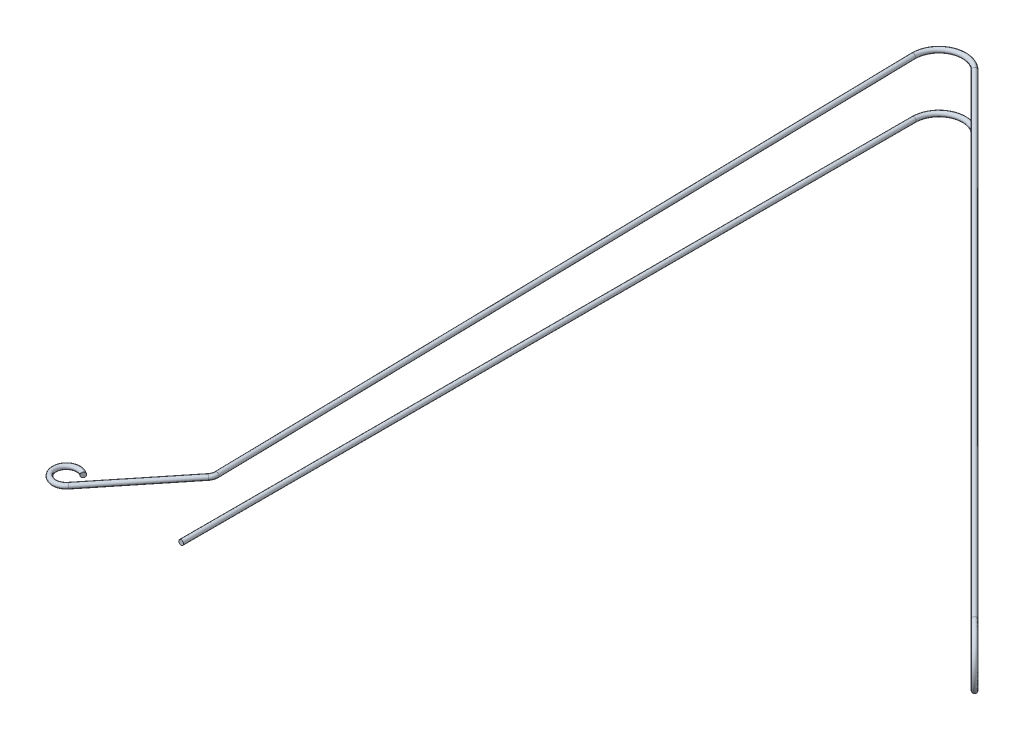
ISO-10303-21;
HEADER;
FILE_DESCRIPTION(('STEP AP214'),'2;1');
FILE_NAME('part.step','',(''),(''),'','','');
FILE_SCHEMA(('AUTOMOTIVE_DESIGN { 1 0 10303 214 1 1 1 1 }'));
ENDSEC;
DATA;
#1=APPLICATION_CONTEXT('core data for automotive mechanical design processes');
#2=APPLICATION_PROTOCOL_DEFINITION('international standard','automotive_design',2000,#1);
#3=PRODUCT_CONTEXT('',#1,'mechanical');
#4=PRODUCT('Part','Part','',(#3));
#5=PRODUCT_RELATED_PRODUCT_CATEGORY('part','',(#4));
#6=PRODUCT_DEFINITION_FORMATION('','',#4);
#7=PRODUCT_DEFINITION_CONTEXT('part definition',#1,'design');
#8=PRODUCT_DEFINITION('design','',#6,#7);
#9=PRODUCT_DEFINITION_SHAPE('','',#8);
#10=(LENGTH_UNIT() NAMED_UNIT(*) SI_UNIT(.MILLI.,.METRE.));
#11=(NAMED_UNIT(*) PLANE_ANGLE_UNIT() SI_UNIT($,.RADIAN.));
#12=(NAMED_UNIT(*) SI_UNIT($,.STERADIAN.) SOLID_ANGLE_UNIT());
#13=UNCERTAINTY_MEASURE_WITH_UNIT(LENGTH_MEASURE(1.E-05),#10,'distance_accuracy_value','');
#14=(GEOMETRIC_REPRESENTATION_CONTEXT(3) GLOBAL_UNCERTAINTY_ASSIGNED_CONTEXT((#13)) GLOBAL_UNIT_ASSIGNED_CONTEXT((#10,
#11,#12)) REPRESENTATION_CONTEXT('',''));
#15=CARTESIAN_POINT('',(0.,0.,0.));
#16=DIRECTION('',(0.,0.,1.));
#17=DIRECTION('',(1.,0.,0.));
#18=AXIS2_PLACEMENT_3D('',#15,#16,#17);
#19=CARTESIAN_POINT('',(0.,0.,0.));
#20=DIRECTION('',(0.,0.,1.));
#21=DIRECTION('',(1.,0.,0.));
#22=AXIS2_PLACEMENT_3D('',#19,#20,#21);
#23=PLANE('',#22);
#24=CARTESIAN_POINT('',(0.,0.,0.));
#25=DIRECTION('',(0.,0.,1.));
#26=DIRECTION('',(1.,0.,0.));
#27=AXIS2_PLACEMENT_3D('',#24,#25,#26);
#28=CIRCLE('',#27,10.);
#29=CARTESIAN_POINT('',(10.,0.,0.));
#30=VERTEX_POINT('',#29);
#31=EDGE_CURVE('E55',#30,#30,#28,.T.);
#32=ORIENTED_EDGE('',*,*,#31,.T.);
#33=EDGE_LOOP('',(#32));
#34=FACE_BOUND('',#33,.T.);
#35=ADVANCED_FACE('F41',(#34),#23,.T.);
#36=CARTESIAN_POINT('',(0.,0.,0.));
#37=DIRECTION('',(0.,0.,-1.));
#38=DIRECTION('',(-1.,0.,0.));
#39=AXIS2_PLACEMENT_3D('',#36,#37,#38);
#40=CYLINDRICAL_SURFACE('',#39,10.);
#41=CARTESIAN_POINT('',(0.,0.,-3050.));
#42=DIRECTION('',(0.,0.,1.));
#43=DIRECTION('',(1.,0.,0.));
#44=AXIS2_PLACEMENT_3D('',#41,#42,#43);
#45=CIRCLE('',#44,10.);
#46=CARTESIAN_POINT('',(-10.0000000000001,0.,-3050.));
#47=VERTEX_POINT('',#46);
#48=EDGE_CURVE('E51',#47,#47,#45,.T.);
#49=ORIENTED_EDGE('',*,*,#48,.T.);
#50=EDGE_LOOP('',(#49));
#51=FACE_BOUND('',#50,.T.);
#52=ORIENTED_EDGE('',*,*,#31,.F.);
#53=EDGE_LOOP('',(#52));
#54=FACE_BOUND('',#53,.T.);
#55=ADVANCED_FACE('F111',(#51,#54),#40,.T.);
#56=CARTESIAN_POINT('',(105.,0.,-3050.));
#57=DIRECTION('',(0.,-1.,0.));
#58=DIRECTION('',(0.,0.,-1.));
#59=AXIS2_PLACEMENT_3D('',#56,#57,#58);
#60=TOROIDAL_SURFACE('',#59,105.,10.);
#61=CARTESIAN_POINT('',(179.246212024588,0.,-3124.24621202459));
#62=DIRECTION('',(-0.707106781186545,0.,-0.70710678118655));
#63=DIRECTION('',(-0.70710678118655,0.,0.707106781186545));
#64=AXIS2_PLACEMENT_3D('',#61,#62,#63);
#65=CIRCLE('',#64,10.);
#66=CARTESIAN_POINT('',(186.317279836453,0.,-3131.31727983645));
#67=VERTEX_POINT('',#66);
#68=EDGE_CURVE('E47',#67,#67,#65,.T.);
#69=CARTESIAN_POINT('',(105.,0.,-3050.));
#70=DIRECTION('',(0.,-1.,0.));
#71=DIRECTION('',(0.,0.,-1.));
#72=AXIS2_PLACEMENT_3D('',#69,#70,#71);
#73=CIRCLE('',#72,115.);
#74=EDGE_CURVE('',#47,#67,#73,.T.);
#75=ORIENTED_EDGE('',*,*,#48,.F.);
#76=ORIENTED_EDGE('',*,*,#68,.T.);
#77=ORIENTED_EDGE('',*,*,#74,.T.);
#78=ORIENTED_EDGE('',*,*,#74,.F.);
#79=EDGE_LOOP('',(#75,#77,#76,#78));
#80=FACE_BOUND('',#79,.T.);
#81=ADVANCED_FACE('F102',(#80),#60,.T.);
#82=CARTESIAN_POINT('',(179.246212024588,0.,-3124.24621202459));
#83=DIRECTION('',(0.707106781186544,0.,0.707106781186551));
#84=DIRECTION('',(0.707106781186551,0.,-0.707106781186544));
#85=AXIS2_PLACEMENT_3D('',#82,#83,#84);
#86=CYLINDRICAL_SURFACE('',#85,10.);
#87=CARTESIAN_POINT('',(2159.14519934691,0.,-1144.34722470224));
#88=DIRECTION('',(-0.707106781186544,0.,-0.707106781186551));
#89=DIRECTION('',(-0.707106781186551,0.,0.707106781186544));
#90=AXIS2_PLACEMENT_3D('',#87,#88,#89);
#91=CIRCLE('',#90,10.);
#92=CARTESIAN_POINT('',(2159.14519934691,-10.0000000000002,-1144.34722470224));
#93=VERTEX_POINT('',#92);
#94=EDGE_CURVE('E11',#93,#93,#91,.T.);
#95=ORIENTED_EDGE('',*,*,#94,.T.);
#96=EDGE_LOOP('',(#95));
#97=FACE_BOUND('',#96,.T.);
#98=ORIENTED_EDGE('',*,*,#68,.F.);
#99=EDGE_LOOP('',(#98));
#100=FACE_BOUND('',#99,.T.);
#101=ADVANCED_FACE('F99',(#97,#100),#86,.T.);
#102=CARTESIAN_POINT('',(2159.14519934691,115.,-1144.34722470224));
#103=DIRECTION('',(-0.707106781186551,0.,0.707106781186544));
#104=DIRECTION('',(0.707106781186544,0.,0.707106781186551));
#105=AXIS2_PLACEMENT_3D('',#102,#103,#104);
#106=TOROIDAL_SURFACE('',#105,115.,10.0000000000002);
#107=CARTESIAN_POINT('',(2159.14519934691,230.,-1144.34722470224));
#108=DIRECTION('',(0.707106781186544,0.,0.707106781186551));
#109=DIRECTION('',(-0.707106781186551,0.,0.707106781186544));
#110=AXIS2_PLACEMENT_3D('',#107,#108,#109);
#111=CIRCLE('',#110,10.0000000000002);
#112=CARTESIAN_POINT('',(2159.14519934691,240.,-1144.34722470224));
#113=VERTEX_POINT('',#112);
#114=EDGE_CURVE('E63',#113,#113,#111,.T.);
#115=CARTESIAN_POINT('',(2159.14519934691,115.,-1144.34722470224));
#116=DIRECTION('',(-0.707106781186551,0.,0.707106781186544));
#117=DIRECTION('',(0.707106781186544,0.,0.707106781186551));
#118=AXIS2_PLACEMENT_3D('',#115,#116,#117);
#119=CIRCLE('',#118,125.);
#120=EDGE_CURVE('',#93,#113,#119,.T.);
#121=ORIENTED_EDGE('',*,*,#94,.F.);
#122=ORIENTED_EDGE('',*,*,#114,.T.);
#123=ORIENTED_EDGE('',*,*,#120,.T.);
#124=ORIENTED_EDGE('',*,*,#120,.F.);
#125=EDGE_LOOP('',(#121,#123,#122,#124));
#126=FACE_BOUND('',#125,.T.);
#127=ADVANCED_FACE('F101',(#126),#106,.T.);
#128=CARTESIAN_POINT('',(2159.14519934691,230.,-1144.34722470224));
#129=DIRECTION('',(-0.707106781186544,0.,-0.707106781186551));
#130=DIRECTION('',(-0.707106781186551,0.,0.707106781186544));
#131=AXIS2_PLACEMENT_3D('',#128,#129,#130);
#132=CYLINDRICAL_SURFACE('',#131,10.0000000000002);
#133=CARTESIAN_POINT('',(179.246212024587,230.,-3124.24621202459));
#134=DIRECTION('',(0.707106781186544,0.,0.707106781186551));
#135=DIRECTION('',(-0.707106781186551,0.,0.707106781186544));
#136=AXIS2_PLACEMENT_3D('',#133,#134,#135);
#137=CIRCLE('',#136,10.0000000000002);
#138=CARTESIAN_POINT('',(186.317279836453,230.,-3131.31727983645));
#139=VERTEX_POINT('',#138);
#140=EDGE_CURVE('E60',#139,#139,#137,.T.);
#141=ORIENTED_EDGE('',*,*,#140,.T.);
#142=EDGE_LOOP('',(#141));
#143=FACE_BOUND('',#142,.T.);
#144=ORIENTED_EDGE('',*,*,#114,.F.);
#145=EDGE_LOOP('',(#144));
#146=FACE_BOUND('',#145,.T.);
#147=ADVANCED_FACE('F107',(#143,#146),#132,.T.);
#148=CARTESIAN_POINT('',(-217.310224390808,230.,190.299758173856));
#149=DIRECTION('',(-0.778790853270297,0.,-0.627283673358811));
#150=DIRECTION('',(-0.627283673358811,0.,0.778790853270297));
#151=AXIS2_PLACEMENT_3D('',#148,#149,#150);
#152=PLANE('',#151);
#153=CARTESIAN_POINT('',(-217.310224390808,230.,190.299758173856));
#154=DIRECTION('',(-0.778790853270297,0.,-0.627283673358811));
#155=DIRECTION('',(-0.627283673358811,0.,0.778790853270297));
#156=AXIS2_PLACEMENT_3D('',#153,#154,#155);
#157=CIRCLE('',#156,10.0000000000003);
#158=CARTESIAN_POINT('',(-211.03738765722,230.,182.511849641153));
#159=VERTEX_POINT('',#158);
#160=EDGE_CURVE('E66',#159,#159,#157,.T.);
#161=ORIENTED_EDGE('',*,*,#160,.F.);
#162=EDGE_LOOP('',(#161));
#163=FACE_BOUND('',#162,.T.);
#164=ADVANCED_FACE('F97',(#163),#152,.F.);
#165=CARTESIAN_POINT('',(105.,230.,-3050.));
#166=DIRECTION('',(0.,1.,0.));
#167=DIRECTION('',(-1.,0.,0.));
#168=AXIS2_PLACEMENT_3D('',#165,#166,#167);
#169=TOROIDAL_SURFACE('',#168,104.999999999999,10.0000000000003);
#170=CARTESIAN_POINT('',(0.0211492582047335,230.,-3047.89265642772));
#171=DIRECTION('',(-0.0200699387835706,0.,-0.9997985784933));
#172=DIRECTION('',(-0.9997985784933,0.,0.0200699387835706));
#173=AXIS2_PLACEMENT_3D('',#170,#171,#172);
#174=CIRCLE('',#173,10.0000000000003);
#175=CARTESIAN_POINT('',(-9.97683652672912,230.,-3047.69195703989));
#176=VERTEX_POINT('',#175);
#177=EDGE_CURVE('E78',#176,#176,#174,.T.);
#178=CARTESIAN_POINT('',(105.,230.,-3050.));
#179=DIRECTION('',(0.,1.,0.));
#180=DIRECTION('',(-1.,0.,0.));
#181=AXIS2_PLACEMENT_3D('',#178,#179,#180);
#182=CIRCLE('',#181,115.);
#183=EDGE_CURVE('',#139,#176,#182,.T.);
#184=ORIENTED_EDGE('',*,*,#140,.F.);
#185=ORIENTED_EDGE('',*,*,#177,.T.);
#186=ORIENTED_EDGE('',*,*,#183,.T.);
#187=ORIENTED_EDGE('',*,*,#183,.F.);
#188=EDGE_LOOP('',(#184,#186,#185,#187));
#189=FACE_BOUND('',#188,.T.);
#190=ADVANCED_FACE('F82',(#189),#169,.T.);
#191=CARTESIAN_POINT('',(0.0211492582051775,230.,-3047.89265642772));
#192=DIRECTION('',(0.0200699387835769,0.,0.9997985784933));
#193=DIRECTION('',(0.9997985784933,0.,-0.0200699387835769));
#194=AXIS2_PLACEMENT_3D('',#191,#192,#193);
#195=CYLINDRICAL_SURFACE('',#194,10.0000000000003);
#196=CARTESIAN_POINT('',(59.4281680575928,230.,-88.4888640875561));
#197=DIRECTION('',(-0.0200699387835787,0.,-0.9997985784933));
#198=DIRECTION('',(-0.9997985784933,0.,0.0200699387835787));
#199=AXIS2_PLACEMENT_3D('',#196,#197,#198);
#200=CIRCLE('',#199,10.0000000000003);
#201=CARTESIAN_POINT('',(69.4261538425256,230.,-88.6895634753918));
#202=VERTEX_POINT('',#201);
#203=EDGE_CURVE('E75',#202,#202,#200,.T.);
#204=ORIENTED_EDGE('',*,*,#203,.T.);
#205=EDGE_LOOP('',(#204));
#206=FACE_BOUND('',#205,.T.);
#207=ORIENTED_EDGE('',*,*,#177,.F.);
#208=EDGE_LOOP('',(#207));
#209=FACE_BOUND('',#208,.T.);
#210=ADVANCED_FACE('F85',(#206,#209),#195,.T.);
#211=CARTESIAN_POINT('',(19.4362249178591,230.,-87.6860665362132));
#212=DIRECTION('',(0.,-1.,0.));
#213=DIRECTION('',(1.,0.,0.));
#214=AXIS2_PLACEMENT_3D('',#211,#212,#213);
#215=TOROIDAL_SURFACE('',#214,40.0000000000012,10.0000000000003);
#216=CARTESIAN_POINT('',(50.5878590486719,230.,-62.5947196018599));
#217=DIRECTION('',(0.627283673358791,0.,-0.778790853270313));
#218=DIRECTION('',(-0.778790853270313,0.,-0.627283673358791));
#219=AXIS2_PLACEMENT_3D('',#216,#217,#218);
#220=CIRCLE('',#219,10.0000000000003);
#221=CARTESIAN_POINT('',(58.375767581375,230.,-56.3218828682716));
#222=VERTEX_POINT('',#221);
#223=EDGE_CURVE('E72',#222,#222,#220,.T.);
#224=CARTESIAN_POINT('',(19.4362249178591,230.,-87.6860665362132));
#225=DIRECTION('',(0.,-1.,0.));
#226=DIRECTION('',(1.,0.,0.));
#227=AXIS2_PLACEMENT_3D('',#224,#225,#226);
#228=CIRCLE('',#227,50.0000000000015);
#229=EDGE_CURVE('',#202,#222,#228,.T.);
#230=ORIENTED_EDGE('',*,*,#203,.F.);
#231=ORIENTED_EDGE('',*,*,#223,.T.);
#232=ORIENTED_EDGE('',*,*,#229,.T.);
#233=ORIENTED_EDGE('',*,*,#229,.F.);
#234=EDGE_LOOP('',(#230,#232,#231,#233));
#235=FACE_BOUND('',#234,.T.);
#236=ADVANCED_FACE('F87',(#235),#215,.T.);
#237=CARTESIAN_POINT('',(50.5878590486719,230.,-62.5947196018602));
#238=DIRECTION('',(-0.627283673358812,0.,0.778790853270296));
#239=DIRECTION('',(0.778790853270296,0.,0.627283673358812));
#240=AXIS2_PLACEMENT_3D('',#237,#238,#239);
#241=CYLINDRICAL_SURFACE('',#240,10.0000000000003);
#242=CARTESIAN_POINT('',(-209.734865395235,230.,260.603484505312));
#243=DIRECTION('',(0.627283673358811,0.,-0.778790853270297));
#244=DIRECTION('',(-0.778790853270297,0.,-0.627283673358811));
#245=AXIS2_PLACEMENT_3D('',#242,#243,#244);
#246=CIRCLE('',#245,10.0000000000003);
#247=CARTESIAN_POINT('',(-201.946956862532,230.,266.876321238901));
#248=VERTEX_POINT('',#247);
#249=EDGE_CURVE('E69',#248,#248,#246,.T.);
#250=ORIENTED_EDGE('',*,*,#249,.T.);
#251=EDGE_LOOP('',(#250));
#252=FACE_BOUND('',#251,.T.);
#253=ORIENTED_EDGE('',*,*,#223,.F.);
#254=EDGE_LOOP('',(#253));
#255=FACE_BOUND('',#254,.T.);
#256=ADVANCED_FACE('F94',(#252,#255),#241,.T.);
#257=CARTESIAN_POINT('',(-248.67440805875,230.,229.239300837371));
#258=DIRECTION('',(0.,-1.,0.));
#259=DIRECTION('',(1.,0.,0.));
#260=AXIS2_PLACEMENT_3D('',#257,#258,#259);
#261=TOROIDAL_SURFACE('',#260,50.0000000000006,10.0000000000003);
#262=CARTESIAN_POINT('',(-248.67440805875,230.,229.239300837371));
#263=DIRECTION('',(0.,-1.,0.));
#264=DIRECTION('',(1.,0.,0.));
#265=AXIS2_PLACEMENT_3D('',#262,#263,#264);
#266=CIRCLE('',#265,60.0000000000009);
#267=EDGE_CURVE('',#248,#159,#266,.T.);
#268=ORIENTED_EDGE('',*,*,#249,.F.);
#269=ORIENTED_EDGE('',*,*,#160,.T.);
#270=ORIENTED_EDGE('',*,*,#267,.T.);
#271=ORIENTED_EDGE('',*,*,#267,.F.);
#272=EDGE_LOOP('',(#268,#270,#269,#271));
#273=FACE_BOUND('',#272,.T.);
#274=ADVANCED_FACE('F110',(#273),#261,.T.);
#275=CLOSED_SHELL('',(#35,#55,#81,#101,#127,#147,#164,#190,#210,#236,#256,#274));
#276=MANIFOLD_SOLID_BREP('B2',#275);
#277=ADVANCED_BREP_SHAPE_REPRESENTATION('',(#18,#276),#14);
#278=SHAPE_DEFINITION_REPRESENTATION(#9,#277);
ENDSEC;
END-ISO-10303-21;
